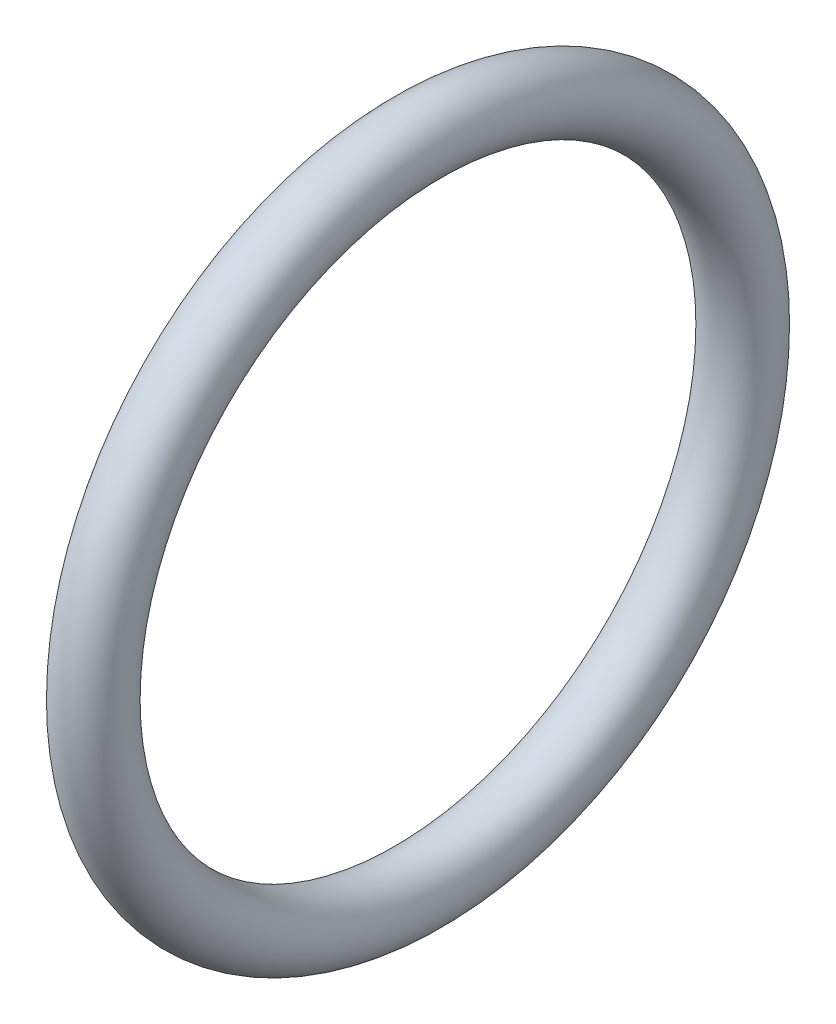
ISO-10303-21;
HEADER;
FILE_DESCRIPTION(('STEP AP214'),'2;1');
FILE_NAME('part.step','',(''),(''),'','','');
FILE_SCHEMA(('AUTOMOTIVE_DESIGN { 1 0 10303 214 1 1 1 1 }'));
ENDSEC;
DATA;
#1=APPLICATION_CONTEXT('core data for automotive mechanical design processes');
#2=APPLICATION_PROTOCOL_DEFINITION('international standard','automotive_design',2000,#1);
#3=PRODUCT_CONTEXT('',#1,'mechanical');
#4=PRODUCT('Part','Part','',(#3));
#5=PRODUCT_RELATED_PRODUCT_CATEGORY('part','',(#4));
#6=PRODUCT_DEFINITION_FORMATION('','',#4);
#7=PRODUCT_DEFINITION_CONTEXT('part definition',#1,'design');
#8=PRODUCT_DEFINITION('design','',#6,#7);
#9=PRODUCT_DEFINITION_SHAPE('','',#8);
#10=(LENGTH_UNIT() NAMED_UNIT(*) SI_UNIT(.MILLI.,.METRE.));
#11=(NAMED_UNIT(*) PLANE_ANGLE_UNIT() SI_UNIT($,.RADIAN.));
#12=(NAMED_UNIT(*) SI_UNIT($,.STERADIAN.) SOLID_ANGLE_UNIT());
#13=UNCERTAINTY_MEASURE_WITH_UNIT(LENGTH_MEASURE(1.E-05),#10,'distance_accuracy_value','');
#14=(GEOMETRIC_REPRESENTATION_CONTEXT(3) GLOBAL_UNCERTAINTY_ASSIGNED_CONTEXT((#13)) GLOBAL_UNIT_ASSIGNED_CONTEXT((#10,
#11,#12)) REPRESENTATION_CONTEXT('',''));
#15=CARTESIAN_POINT('',(0.,0.,0.));
#16=DIRECTION('',(0.,0.,1.));
#17=DIRECTION('',(1.,0.,0.));
#18=AXIS2_PLACEMENT_3D('',#15,#16,#17);
#19=CARTESIAN_POINT('',(0.,0.,0.));
#20=DIRECTION('',(-1.,0.,0.));
#21=DIRECTION('',(0.,0.,1.));
#22=AXIS2_PLACEMENT_3D('',#19,#20,#21);
#23=TOROIDAL_SURFACE('',#22,12.25,1.25);
#24=ADVANCED_FACE('F13',(),#23,.T.);
#25=CLOSED_SHELL('',(#24));
#26=MANIFOLD_SOLID_BREP('B1',#25);
#27=ADVANCED_BREP_SHAPE_REPRESENTATION('',(#18,#26),#14);
#28=SHAPE_DEFINITION_REPRESENTATION(#9,#27);
ENDSEC;
END-ISO-10303-21;
